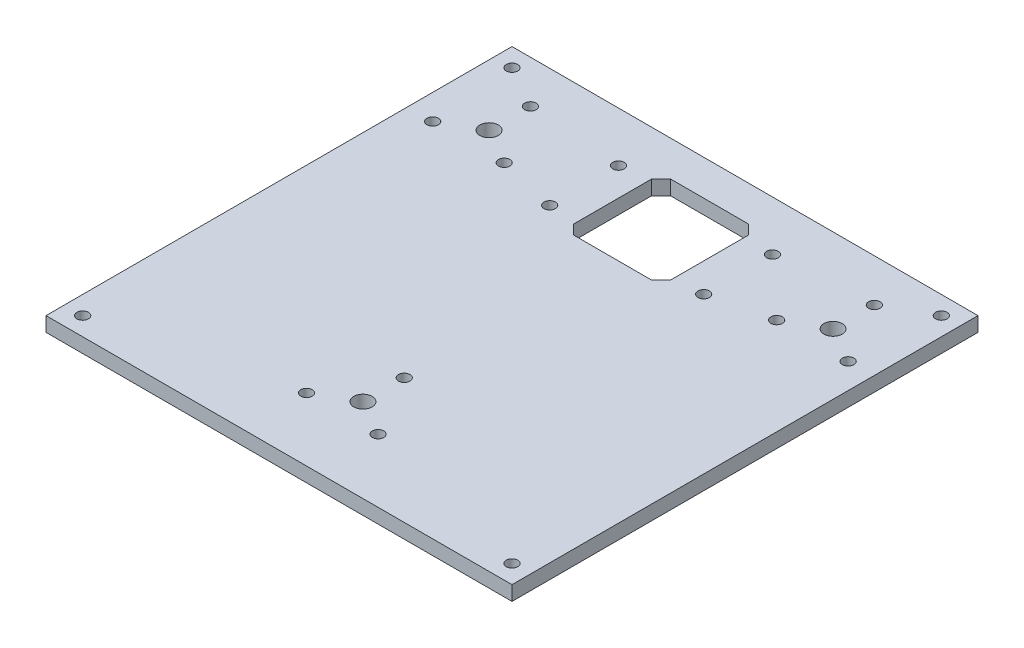
ISO-10303-21;
HEADER;
FILE_DESCRIPTION(('STEP AP214'),'2;1');
FILE_NAME('part.step','',(''),(''),'','','');
FILE_SCHEMA(('AUTOMOTIVE_DESIGN { 1 0 10303 214 1 1 1 1 }'));
ENDSEC;
DATA;
#1=APPLICATION_CONTEXT('core data for automotive mechanical design processes');
#2=APPLICATION_PROTOCOL_DEFINITION('international standard','automotive_design',2000,#1);
#3=PRODUCT_CONTEXT('',#1,'mechanical');
#4=PRODUCT('Part','Part','',(#3));
#5=PRODUCT_RELATED_PRODUCT_CATEGORY('part','',(#4));
#6=PRODUCT_DEFINITION_FORMATION('','',#4);
#7=PRODUCT_DEFINITION_CONTEXT('part definition',#1,'design');
#8=PRODUCT_DEFINITION('design','',#6,#7);
#9=PRODUCT_DEFINITION_SHAPE('','',#8);
#10=(LENGTH_UNIT() NAMED_UNIT(*) SI_UNIT(.MILLI.,.METRE.));
#11=(NAMED_UNIT(*) PLANE_ANGLE_UNIT() SI_UNIT($,.RADIAN.));
#12=(NAMED_UNIT(*) SI_UNIT($,.STERADIAN.) SOLID_ANGLE_UNIT());
#13=UNCERTAINTY_MEASURE_WITH_UNIT(LENGTH_MEASURE(1.E-05),#10,'distance_accuracy_value','');
#14=(GEOMETRIC_REPRESENTATION_CONTEXT(3) GLOBAL_UNCERTAINTY_ASSIGNED_CONTEXT((#13)) GLOBAL_UNIT_ASSIGNED_CONTEXT((#10,
#11,#12)) REPRESENTATION_CONTEXT('',''));
#15=CARTESIAN_POINT('',(0.,0.,0.));
#16=DIRECTION('',(0.,0.,1.));
#17=DIRECTION('',(1.,0.,0.));
#18=AXIS2_PLACEMENT_3D('',#15,#16,#17);
#19=CARTESIAN_POINT('',(101.6,6.35,101.6));
#20=DIRECTION('',(-1.,0.,0.));
#21=DIRECTION('',(0.,0.,1.));
#22=AXIS2_PLACEMENT_3D('',#19,#20,#21);
#23=PLANE('',#22);
#24=DIRECTION('',(0.,0.,-1.));
#25=VECTOR('',#24,1.);
#26=CARTESIAN_POINT('',(101.6,0.,101.6));
#27=LINE('',#26,#25);
#28=CARTESIAN_POINT('',(101.6,0.,101.6));
#29=VERTEX_POINT('',#28);
#30=CARTESIAN_POINT('',(101.6,0.,-101.6));
#31=VERTEX_POINT('',#30);
#32=EDGE_CURVE('E199',#29,#31,#27,.T.);
#33=ORIENTED_EDGE('',*,*,#32,.T.);
#34=DIRECTION('',(0.,-1.,0.));
#35=VECTOR('',#34,1.);
#36=CARTESIAN_POINT('',(101.6,6.35,-101.6));
#37=LINE('',#36,#35);
#38=CARTESIAN_POINT('',(101.6,6.35,-101.6));
#39=VERTEX_POINT('',#38);
#40=EDGE_CURVE('E11',#39,#31,#37,.T.);
#41=ORIENTED_EDGE('',*,*,#40,.F.);
#42=DIRECTION('',(0.,0.,-1.));
#43=VECTOR('',#42,1.);
#44=CARTESIAN_POINT('',(101.6,6.35,101.6));
#45=LINE('',#44,#43);
#46=CARTESIAN_POINT('',(101.6,6.35,101.6));
#47=VERTEX_POINT('',#46);
#48=EDGE_CURVE('E214',#47,#39,#45,.T.);
#49=ORIENTED_EDGE('',*,*,#48,.F.);
#50=DIRECTION('',(0.,-1.,0.));
#51=VECTOR('',#50,1.);
#52=CARTESIAN_POINT('',(101.6,6.35,101.6));
#53=LINE('',#52,#51);
#54=EDGE_CURVE('E224',#47,#29,#53,.T.);
#55=ORIENTED_EDGE('',*,*,#54,.T.);
#56=EDGE_LOOP('',(#33,#41,#49,#55));
#57=FACE_BOUND('',#56,.T.);
#58=ADVANCED_FACE('F35',(#57),#23,.F.);
#59=CARTESIAN_POINT('',(-101.6,6.35,-101.6));
#60=DIRECTION('',(0.,0.,1.));
#61=DIRECTION('',(1.,0.,0.));
#62=AXIS2_PLACEMENT_3D('',#59,#60,#61);
#63=PLANE('',#62);
#64=DIRECTION('',(-1.,0.,0.));
#65=VECTOR('',#64,1.);
#66=CARTESIAN_POINT('',(-101.6,0.,-101.6));
#67=LINE('',#66,#65);
#68=CARTESIAN_POINT('',(-101.6,0.,-101.6));
#69=VERTEX_POINT('',#68);
#70=EDGE_CURVE('E227',#31,#69,#67,.T.);
#71=ORIENTED_EDGE('',*,*,#70,.T.);
#72=DIRECTION('',(0.,-1.,0.));
#73=VECTOR('',#72,1.);
#74=CARTESIAN_POINT('',(-101.6,6.35,-101.6));
#75=LINE('',#74,#73);
#76=CARTESIAN_POINT('',(-101.6,6.35,-101.6));
#77=VERTEX_POINT('',#76);
#78=EDGE_CURVE('E42',#77,#69,#75,.T.);
#79=ORIENTED_EDGE('',*,*,#78,.F.);
#80=DIRECTION('',(-1.,0.,0.));
#81=VECTOR('',#80,1.);
#82=CARTESIAN_POINT('',(-101.6,6.35,-101.6));
#83=LINE('',#82,#81);
#84=EDGE_CURVE('E217',#39,#77,#83,.T.);
#85=ORIENTED_EDGE('',*,*,#84,.F.);
#86=ORIENTED_EDGE('',*,*,#40,.T.);
#87=EDGE_LOOP('',(#71,#79,#85,#86));
#88=FACE_BOUND('',#87,.T.);
#89=ADVANCED_FACE('F256',(#88),#63,.F.);
#90=CARTESIAN_POINT('',(-101.6,6.35,101.6));
#91=DIRECTION('',(1.,0.,0.));
#92=DIRECTION('',(0.,0.,-1.));
#93=AXIS2_PLACEMENT_3D('',#90,#91,#92);
#94=PLANE('',#93);
#95=DIRECTION('',(0.,0.,1.));
#96=VECTOR('',#95,1.);
#97=CARTESIAN_POINT('',(-101.6,0.,101.6));
#98=LINE('',#97,#96);
#99=CARTESIAN_POINT('',(-101.6,0.,101.6));
#100=VERTEX_POINT('',#99);
#101=EDGE_CURVE('E229',#69,#100,#98,.T.);
#102=ORIENTED_EDGE('',*,*,#101,.T.);
#103=DIRECTION('',(0.,-1.,0.));
#104=VECTOR('',#103,1.);
#105=CARTESIAN_POINT('',(-101.6,6.35,101.6));
#106=LINE('',#105,#104);
#107=CARTESIAN_POINT('',(-101.6,6.35,101.6));
#108=VERTEX_POINT('',#107);
#109=EDGE_CURVE('E234',#108,#100,#106,.T.);
#110=ORIENTED_EDGE('',*,*,#109,.F.);
#111=DIRECTION('',(0.,0.,1.));
#112=VECTOR('',#111,1.);
#113=CARTESIAN_POINT('',(-101.6,6.35,101.6));
#114=LINE('',#113,#112);
#115=EDGE_CURVE('E220',#77,#108,#114,.T.);
#116=ORIENTED_EDGE('',*,*,#115,.F.);
#117=ORIENTED_EDGE('',*,*,#78,.T.);
#118=EDGE_LOOP('',(#102,#110,#116,#117));
#119=FACE_BOUND('',#118,.T.);
#120=ADVANCED_FACE('F241',(#119),#94,.F.);
#121=CARTESIAN_POINT('',(-101.6,6.35,101.6));
#122=DIRECTION('',(0.,0.,-1.));
#123=DIRECTION('',(-1.,0.,0.));
#124=AXIS2_PLACEMENT_3D('',#121,#122,#123);
#125=PLANE('',#124);
#126=DIRECTION('',(1.,0.,0.));
#127=VECTOR('',#126,1.);
#128=CARTESIAN_POINT('',(-101.6,0.,101.6));
#129=LINE('',#128,#127);
#130=EDGE_CURVE('E218',#100,#29,#129,.T.);
#131=ORIENTED_EDGE('',*,*,#130,.T.);
#132=ORIENTED_EDGE('',*,*,#54,.F.);
#133=DIRECTION('',(1.,0.,0.));
#134=VECTOR('',#133,1.);
#135=CARTESIAN_POINT('',(-101.6,6.35,101.6));
#136=LINE('',#135,#134);
#137=EDGE_CURVE('E222',#108,#47,#136,.T.);
#138=ORIENTED_EDGE('',*,*,#137,.F.);
#139=ORIENTED_EDGE('',*,*,#109,.T.);
#140=EDGE_LOOP('',(#131,#132,#138,#139));
#141=FACE_BOUND('',#140,.T.);
#142=ADVANCED_FACE('F249',(#141),#125,.F.);
#143=CARTESIAN_POINT('',(0.,6.35,0.));
#144=DIRECTION('',(0.,-1.,0.));
#145=DIRECTION('',(0.,0.,-1.));
#146=AXIS2_PLACEMENT_3D('',#143,#144,#145);
#147=PLANE('',#146);
#148=CARTESIAN_POINT('',(15.5884572681198,6.35,74.0000000000001));
#149=DIRECTION('',(0.,1.,0.));
#150=DIRECTION('',(0.,0.,1.));
#151=AXIS2_PLACEMENT_3D('',#148,#149,#150);
#152=CIRCLE('',#151,2.5);
#153=CARTESIAN_POINT('',(15.5884572681198,6.35,76.5000000000001));
#154=VERTEX_POINT('',#153);
#155=EDGE_CURVE('E414',#154,#154,#152,.T.);
#156=ORIENTED_EDGE('',*,*,#155,.F.);
#157=EDGE_LOOP('',(#156));
#158=FACE_BOUND('',#157,.T.);
#159=CARTESIAN_POINT('',(0.,6.35,47.0000000000001));
#160=DIRECTION('',(0.,1.,0.));
#161=DIRECTION('',(0.,0.,1.));
#162=AXIS2_PLACEMENT_3D('',#159,#160,#161);
#163=CIRCLE('',#162,2.5);
#164=CARTESIAN_POINT('',(0.,6.35,49.5000000000001));
#165=VERTEX_POINT('',#164);
#166=EDGE_CURVE('E420',#165,#165,#163,.T.);
#167=ORIENTED_EDGE('',*,*,#166,.F.);
#168=EDGE_LOOP('',(#167));
#169=FACE_BOUND('',#168,.T.);
#170=CARTESIAN_POINT('',(90.5884572681198,6.35,-55.9999999999998));
#171=DIRECTION('',(0.,1.,0.));
#172=DIRECTION('',(0.,0.,1.));
#173=AXIS2_PLACEMENT_3D('',#170,#171,#172);
#174=CIRCLE('',#173,2.5);
#175=CARTESIAN_POINT('',(90.5884572681198,6.35,-53.4999999999998));
#176=VERTEX_POINT('',#175);
#177=EDGE_CURVE('E426',#176,#176,#174,.T.);
#178=ORIENTED_EDGE('',*,*,#177,.F.);
#179=EDGE_LOOP('',(#178));
#180=FACE_BOUND('',#179,.T.);
#181=CARTESIAN_POINT('',(59.41154273188,6.35,-55.9999999999998));
#182=DIRECTION('',(0.,1.,0.));
#183=DIRECTION('',(0.,0.,1.));
#184=AXIS2_PLACEMENT_3D('',#181,#182,#183);
#185=CIRCLE('',#184,2.50000000000001);
#186=CARTESIAN_POINT('',(59.41154273188,6.35,-53.4999999999998));
#187=VERTEX_POINT('',#186);
#188=EDGE_CURVE('E401',#187,#187,#185,.T.);
#189=ORIENTED_EDGE('',*,*,#188,.F.);
#190=EDGE_LOOP('',(#189));
#191=FACE_BOUND('',#190,.T.);
#192=CARTESIAN_POINT('',(-75.,6.35,-82.9999999999998));
#193=DIRECTION('',(0.,1.,0.));
#194=DIRECTION('',(0.,0.,1.));
#195=AXIS2_PLACEMENT_3D('',#192,#193,#194);
#196=CIRCLE('',#195,2.5);
#197=CARTESIAN_POINT('',(-75.,6.35,-80.4999999999998));
#198=VERTEX_POINT('',#197);
#199=EDGE_CURVE('E393',#198,#198,#196,.T.);
#200=ORIENTED_EDGE('',*,*,#199,.F.);
#201=EDGE_LOOP('',(#200));
#202=FACE_BOUND('',#201,.T.);
#203=CARTESIAN_POINT('',(-59.4115427318801,6.35,-55.9999999999998));
#204=DIRECTION('',(0.,1.,0.));
#205=DIRECTION('',(0.,0.,1.));
#206=AXIS2_PLACEMENT_3D('',#203,#204,#205);
#207=CIRCLE('',#206,2.5);
#208=CARTESIAN_POINT('',(-59.4115427318801,6.35,-53.4999999999998));
#209=VERTEX_POINT('',#208);
#210=EDGE_CURVE('E386',#209,#209,#207,.T.);
#211=ORIENTED_EDGE('',*,*,#210,.F.);
#212=EDGE_LOOP('',(#211));
#213=FACE_BOUND('',#212,.T.);
#214=CARTESIAN_POINT('',(-90.5884572681199,6.35,-55.9999999999998));
#215=DIRECTION('',(0.,1.,0.));
#216=DIRECTION('',(0.,0.,1.));
#217=AXIS2_PLACEMENT_3D('',#214,#215,#216);
#218=CIRCLE('',#217,2.5);
#219=CARTESIAN_POINT('',(-90.5884572681199,6.35,-53.4999999999998));
#220=VERTEX_POINT('',#219);
#221=EDGE_CURVE('E390',#220,#220,#218,.T.);
#222=ORIENTED_EDGE('',*,*,#221,.F.);
#223=EDGE_LOOP('',(#222));
#224=FACE_BOUND('',#223,.T.);
#225=CARTESIAN_POINT('',(74.9999999999999,6.35,-82.9999999999998));
#226=DIRECTION('',(0.,1.,0.));
#227=DIRECTION('',(0.,0.,1.));
#228=AXIS2_PLACEMENT_3D('',#225,#226,#227);
#229=CIRCLE('',#228,2.5);
#230=CARTESIAN_POINT('',(74.9999999999999,6.35,-80.4999999999998));
#231=VERTEX_POINT('',#230);
#232=EDGE_CURVE('E402',#231,#231,#229,.T.);
#233=ORIENTED_EDGE('',*,*,#232,.F.);
#234=EDGE_LOOP('',(#233));
#235=FACE_BOUND('',#234,.T.);
#236=CARTESIAN_POINT('',(-15.58845726812,6.35,74.0000000000001));
#237=DIRECTION('',(0.,1.,0.));
#238=DIRECTION('',(0.,0.,1.));
#239=AXIS2_PLACEMENT_3D('',#236,#237,#238);
#240=CIRCLE('',#239,2.50000000000001);
#241=CARTESIAN_POINT('',(-15.58845726812,6.35,76.5000000000001));
#242=VERTEX_POINT('',#241);
#243=EDGE_CURVE('E413',#242,#242,#240,.T.);
#244=ORIENTED_EDGE('',*,*,#243,.F.);
#245=EDGE_LOOP('',(#244));
#246=FACE_BOUND('',#245,.T.);
#247=CARTESIAN_POINT('',(93.6,6.35,-93.6));
#248=DIRECTION('',(0.,1.,0.));
#249=DIRECTION('',(0.,0.,1.));
#250=AXIS2_PLACEMENT_3D('',#247,#248,#249);
#251=CIRCLE('',#250,2.5);
#252=CARTESIAN_POINT('',(93.6,6.35,-91.1));
#253=VERTEX_POINT('',#252);
#254=EDGE_CURVE('E437',#253,#253,#251,.T.);
#255=ORIENTED_EDGE('',*,*,#254,.F.);
#256=EDGE_LOOP('',(#255));
#257=FACE_BOUND('',#256,.T.);
#258=CARTESIAN_POINT('',(-93.6,6.35,-93.6));
#259=DIRECTION('',(0.,1.,0.));
#260=DIRECTION('',(0.,0.,1.));
#261=AXIS2_PLACEMENT_3D('',#258,#259,#260);
#262=CIRCLE('',#261,2.5);
#263=CARTESIAN_POINT('',(-93.6,6.35,-91.1));
#264=VERTEX_POINT('',#263);
#265=EDGE_CURVE('E450',#264,#264,#262,.T.);
#266=ORIENTED_EDGE('',*,*,#265,.F.);
#267=EDGE_LOOP('',(#266));
#268=FACE_BOUND('',#267,.T.);
#269=CARTESIAN_POINT('',(-93.6,6.35,93.6));
#270=DIRECTION('',(0.,1.,0.));
#271=DIRECTION('',(0.,0.,1.));
#272=AXIS2_PLACEMENT_3D('',#269,#270,#271);
#273=CIRCLE('',#272,2.5);
#274=CARTESIAN_POINT('',(-93.6,6.35,96.1));
#275=VERTEX_POINT('',#274);
#276=EDGE_CURVE('E444',#275,#275,#273,.T.);
#277=ORIENTED_EDGE('',*,*,#276,.F.);
#278=EDGE_LOOP('',(#277));
#279=FACE_BOUND('',#278,.T.);
#280=CARTESIAN_POINT('',(93.6,6.35,93.6));
#281=DIRECTION('',(0.,1.,0.));
#282=DIRECTION('',(0.,0.,1.));
#283=AXIS2_PLACEMENT_3D('',#280,#281,#282);
#284=CIRCLE('',#283,2.5);
#285=CARTESIAN_POINT('',(93.6,6.35,96.1));
#286=VERTEX_POINT('',#285);
#287=EDGE_CURVE('E443',#286,#286,#284,.T.);
#288=ORIENTED_EDGE('',*,*,#287,.F.);
#289=EDGE_LOOP('',(#288));
#290=FACE_BOUND('',#289,.T.);
#291=CARTESIAN_POINT('',(-33.425,6.35,-79.8500000000001));
#292=DIRECTION('',(0.,1.,0.));
#293=DIRECTION('',(0.,0.,1.));
#294=AXIS2_PLACEMENT_3D('',#291,#292,#293);
#295=CIRCLE('',#294,2.5);
#296=CARTESIAN_POINT('',(-33.425,6.35,-77.3500000000001));
#297=VERTEX_POINT('',#296);
#298=EDGE_CURVE('E473',#297,#297,#295,.T.);
#299=ORIENTED_EDGE('',*,*,#298,.F.);
#300=EDGE_LOOP('',(#299));
#301=FACE_BOUND('',#300,.T.);
#302=CARTESIAN_POINT('',(33.725,6.35,-49.8500000000001));
#303=DIRECTION('',(0.,1.,0.));
#304=DIRECTION('',(0.,0.,1.));
#305=AXIS2_PLACEMENT_3D('',#302,#303,#304);
#306=CIRCLE('',#305,2.5);
#307=CARTESIAN_POINT('',(33.725,6.35,-47.3500000000001));
#308=VERTEX_POINT('',#307);
#309=EDGE_CURVE('E467',#308,#308,#306,.T.);
#310=ORIENTED_EDGE('',*,*,#309,.F.);
#311=EDGE_LOOP('',(#310));
#312=FACE_BOUND('',#311,.T.);
#313=CARTESIAN_POINT('',(33.725,6.35,-79.8500000000001));
#314=DIRECTION('',(0.,1.,0.));
#315=DIRECTION('',(0.,0.,1.));
#316=AXIS2_PLACEMENT_3D('',#313,#314,#315);
#317=CIRCLE('',#316,2.5);
#318=CARTESIAN_POINT('',(33.725,6.35,-77.3500000000001));
#319=VERTEX_POINT('',#318);
#320=EDGE_CURVE('E461',#319,#319,#317,.T.);
#321=ORIENTED_EDGE('',*,*,#320,.F.);
#322=EDGE_LOOP('',(#321));
#323=FACE_BOUND('',#322,.T.);
#324=CARTESIAN_POINT('',(-33.425,6.35,-49.8500000000001));
#325=DIRECTION('',(0.,1.,0.));
#326=DIRECTION('',(0.,0.,1.));
#327=AXIS2_PLACEMENT_3D('',#324,#325,#326);
#328=CIRCLE('',#327,2.5);
#329=CARTESIAN_POINT('',(-33.425,6.35,-47.3500000000001));
#330=VERTEX_POINT('',#329);
#331=EDGE_CURVE('E148',#330,#330,#328,.T.);
#332=ORIENTED_EDGE('',*,*,#331,.F.);
#333=EDGE_LOOP('',(#332));
#334=FACE_BOUND('',#333,.T.);
#335=DIRECTION('',(-0.707106781186547,0.,0.707106781186548));
#336=VECTOR('',#335,1.);
#337=CARTESIAN_POINT('',(-17.05,6.35,-86.15));
#338=LINE('',#337,#336);
#339=CARTESIAN_POINT('',(-17.05,6.35,-86.15));
#340=VERTEX_POINT('',#339);
#341=CARTESIAN_POINT('',(-21.15,6.35,-82.05));
#342=VERTEX_POINT('',#341);
#343=EDGE_CURVE('E165',#340,#342,#338,.T.);
#344=ORIENTED_EDGE('',*,*,#343,.F.);
#345=DIRECTION('',(-1.,0.,0.));
#346=VECTOR('',#345,1.);
#347=CARTESIAN_POINT('',(17.05,6.35,-86.15));
#348=LINE('',#347,#346);
#349=CARTESIAN_POINT('',(17.05,6.35,-86.15));
#350=VERTEX_POINT('',#349);
#351=EDGE_CURVE('E49',#350,#340,#348,.T.);
#352=ORIENTED_EDGE('',*,*,#351,.F.);
#353=DIRECTION('',(-0.707106781186548,0.,-0.707106781186547));
#354=VECTOR('',#353,1.);
#355=CARTESIAN_POINT('',(21.15,6.35,-82.05));
#356=LINE('',#355,#354);
#357=CARTESIAN_POINT('',(21.15,6.35,-82.05));
#358=VERTEX_POINT('',#357);
#359=EDGE_CURVE('E142',#358,#350,#356,.T.);
#360=ORIENTED_EDGE('',*,*,#359,.F.);
#361=DIRECTION('',(0.,0.,-1.));
#362=VECTOR('',#361,1.);
#363=CARTESIAN_POINT('',(21.15,6.35,-47.95));
#364=LINE('',#363,#362);
#365=CARTESIAN_POINT('',(21.15,6.35,-47.95));
#366=VERTEX_POINT('',#365);
#367=EDGE_CURVE('E145',#366,#358,#364,.T.);
#368=ORIENTED_EDGE('',*,*,#367,.F.);
#369=DIRECTION('',(0.707106781186548,0.,-0.707106781186548));
#370=VECTOR('',#369,1.);
#371=CARTESIAN_POINT('',(17.05,6.35,-43.85));
#372=LINE('',#371,#370);
#373=CARTESIAN_POINT('',(17.05,6.35,-43.85));
#374=VERTEX_POINT('',#373);
#375=EDGE_CURVE('E177',#374,#366,#372,.T.);
#376=ORIENTED_EDGE('',*,*,#375,.F.);
#377=DIRECTION('',(1.,0.,0.));
#378=VECTOR('',#377,1.);
#379=CARTESIAN_POINT('',(-17.05,6.35,-43.85));
#380=LINE('',#379,#378);
#381=CARTESIAN_POINT('',(-17.05,6.35,-43.85));
#382=VERTEX_POINT('',#381);
#383=EDGE_CURVE('E174',#382,#374,#380,.T.);
#384=ORIENTED_EDGE('',*,*,#383,.F.);
#385=DIRECTION('',(0.707106781186547,0.,0.707106781186548));
#386=VECTOR('',#385,1.);
#387=CARTESIAN_POINT('',(-21.15,6.35,-47.95));
#388=LINE('',#387,#386);
#389=CARTESIAN_POINT('',(-21.15,6.35,-47.95));
#390=VERTEX_POINT('',#389);
#391=EDGE_CURVE('E171',#390,#382,#388,.T.);
#392=ORIENTED_EDGE('',*,*,#391,.F.);
#393=DIRECTION('',(0.,0.,1.));
#394=VECTOR('',#393,1.);
#395=CARTESIAN_POINT('',(-21.15,6.35,-82.05));
#396=LINE('',#395,#394);
#397=EDGE_CURVE('E168',#342,#390,#396,.T.);
#398=ORIENTED_EDGE('',*,*,#397,.F.);
#399=EDGE_LOOP('',(#344,#352,#360,#368,#376,#384,#392,#398));
#400=FACE_BOUND('',#399,.T.);
#401=CARTESIAN_POINT('',(-75.,6.35,-65.));
#402=DIRECTION('',(0.,1.,0.));
#403=DIRECTION('',(0.,0.,1.));
#404=AXIS2_PLACEMENT_3D('',#401,#402,#403);
#405=CIRCLE('',#404,4.00000000000002);
#406=CARTESIAN_POINT('',(-75.,6.35,-61.));
#407=VERTEX_POINT('',#406);
#408=EDGE_CURVE('E200',#407,#407,#405,.T.);
#409=ORIENTED_EDGE('',*,*,#408,.F.);
#410=EDGE_LOOP('',(#409));
#411=FACE_BOUND('',#410,.T.);
#412=CARTESIAN_POINT('',(75.,6.35,-65.));
#413=DIRECTION('',(0.,1.,0.));
#414=DIRECTION('',(0.,0.,1.));
#415=AXIS2_PLACEMENT_3D('',#412,#413,#414);
#416=CIRCLE('',#415,4.00000000000002);
#417=CARTESIAN_POINT('',(75.,6.35,-61.));
#418=VERTEX_POINT('',#417);
#419=EDGE_CURVE('E206',#418,#418,#416,.T.);
#420=ORIENTED_EDGE('',*,*,#419,.F.);
#421=EDGE_LOOP('',(#420));
#422=FACE_BOUND('',#421,.T.);
#423=CARTESIAN_POINT('',(0.,6.35,65.));
#424=DIRECTION('',(0.,1.,0.));
#425=DIRECTION('',(0.,0.,1.));
#426=AXIS2_PLACEMENT_3D('',#423,#424,#425);
#427=CIRCLE('',#426,4.);
#428=CARTESIAN_POINT('',(0.,6.35,69.));
#429=VERTEX_POINT('',#428);
#430=EDGE_CURVE('E184',#429,#429,#427,.T.);
#431=ORIENTED_EDGE('',*,*,#430,.F.);
#432=EDGE_LOOP('',(#431));
#433=FACE_BOUND('',#432,.T.);
#434=ORIENTED_EDGE('',*,*,#48,.T.);
#435=ORIENTED_EDGE('',*,*,#84,.T.);
#436=ORIENTED_EDGE('',*,*,#115,.T.);
#437=ORIENTED_EDGE('',*,*,#137,.T.);
#438=EDGE_LOOP('',(#434,#435,#436,#437));
#439=FACE_BOUND('',#438,.T.);
#440=ADVANCED_FACE('F255',(#158,#169,#180,#191,#202,#213,#224,#235,#246,#257,#268,#279,#290,
#301,#312,#323,#334,#400,#411,#422,#433,#439),#147,.F.);
#441=CARTESIAN_POINT('',(0.,0.,0.));
#442=DIRECTION('',(0.,-1.,0.));
#443=DIRECTION('',(0.,0.,-1.));
#444=AXIS2_PLACEMENT_3D('',#441,#442,#443);
#445=PLANE('',#444);
#446=CARTESIAN_POINT('',(15.5884572681198,0.,74.0000000000001));
#447=DIRECTION('',(0.,1.,0.));
#448=DIRECTION('',(0.,0.,1.));
#449=AXIS2_PLACEMENT_3D('',#446,#447,#448);
#450=CIRCLE('',#449,2.5);
#451=CARTESIAN_POINT('',(15.5884572681198,0.,76.5000000000001));
#452=VERTEX_POINT('',#451);
#453=EDGE_CURVE('E410',#452,#452,#450,.T.);
#454=ORIENTED_EDGE('',*,*,#453,.T.);
#455=EDGE_LOOP('',(#454));
#456=FACE_BOUND('',#455,.T.);
#457=CARTESIAN_POINT('',(0.,0.,47.0000000000001));
#458=DIRECTION('',(0.,1.,0.));
#459=DIRECTION('',(0.,0.,1.));
#460=AXIS2_PLACEMENT_3D('',#457,#458,#459);
#461=CIRCLE('',#460,2.5);
#462=CARTESIAN_POINT('',(0.,0.,49.5000000000001));
#463=VERTEX_POINT('',#462);
#464=EDGE_CURVE('E417',#463,#463,#461,.T.);
#465=ORIENTED_EDGE('',*,*,#464,.T.);
#466=EDGE_LOOP('',(#465));
#467=FACE_BOUND('',#466,.T.);
#468=CARTESIAN_POINT('',(90.5884572681198,0.,-55.9999999999998));
#469=DIRECTION('',(0.,1.,0.));
#470=DIRECTION('',(0.,0.,1.));
#471=AXIS2_PLACEMENT_3D('',#468,#469,#470);
#472=CIRCLE('',#471,2.5);
#473=CARTESIAN_POINT('',(90.5884572681198,0.,-53.4999999999998));
#474=VERTEX_POINT('',#473);
#475=EDGE_CURVE('E423',#474,#474,#472,.T.);
#476=ORIENTED_EDGE('',*,*,#475,.T.);
#477=EDGE_LOOP('',(#476));
#478=FACE_BOUND('',#477,.T.);
#479=CARTESIAN_POINT('',(59.41154273188,0.,-55.9999999999998));
#480=DIRECTION('',(0.,1.,0.));
#481=DIRECTION('',(0.,0.,1.));
#482=AXIS2_PLACEMENT_3D('',#479,#480,#481);
#483=CIRCLE('',#482,2.50000000000001);
#484=CARTESIAN_POINT('',(59.41154273188,0.,-53.4999999999998));
#485=VERTEX_POINT('',#484);
#486=EDGE_CURVE('E429',#485,#485,#483,.T.);
#487=ORIENTED_EDGE('',*,*,#486,.T.);
#488=EDGE_LOOP('',(#487));
#489=FACE_BOUND('',#488,.T.);
#490=CARTESIAN_POINT('',(-75.,0.,-82.9999999999998));
#491=DIRECTION('',(0.,1.,0.));
#492=DIRECTION('',(0.,0.,1.));
#493=AXIS2_PLACEMENT_3D('',#490,#491,#492);
#494=CIRCLE('',#493,2.5);
#495=CARTESIAN_POINT('',(-75.,0.,-80.4999999999998));
#496=VERTEX_POINT('',#495);
#497=EDGE_CURVE('E388',#496,#496,#494,.T.);
#498=ORIENTED_EDGE('',*,*,#497,.T.);
#499=EDGE_LOOP('',(#498));
#500=FACE_BOUND('',#499,.T.);
#501=CARTESIAN_POINT('',(-59.4115427318801,0.,-55.9999999999998));
#502=DIRECTION('',(0.,1.,0.));
#503=DIRECTION('',(0.,0.,1.));
#504=AXIS2_PLACEMENT_3D('',#501,#502,#503);
#505=CIRCLE('',#504,2.5);
#506=CARTESIAN_POINT('',(-59.4115427318801,0.,-53.4999999999998));
#507=VERTEX_POINT('',#506);
#508=EDGE_CURVE('E383',#507,#507,#505,.T.);
#509=ORIENTED_EDGE('',*,*,#508,.T.);
#510=EDGE_LOOP('',(#509));
#511=FACE_BOUND('',#510,.T.);
#512=CARTESIAN_POINT('',(-90.5884572681199,0.,-55.9999999999998));
#513=DIRECTION('',(0.,1.,0.));
#514=DIRECTION('',(0.,0.,1.));
#515=AXIS2_PLACEMENT_3D('',#512,#513,#514);
#516=CIRCLE('',#515,2.5);
#517=CARTESIAN_POINT('',(-90.5884572681199,0.,-53.4999999999998));
#518=VERTEX_POINT('',#517);
#519=EDGE_CURVE('E405',#518,#518,#516,.T.);
#520=ORIENTED_EDGE('',*,*,#519,.T.);
#521=EDGE_LOOP('',(#520));
#522=FACE_BOUND('',#521,.T.);
#523=CARTESIAN_POINT('',(74.9999999999999,0.,-82.9999999999998));
#524=DIRECTION('',(0.,1.,0.));
#525=DIRECTION('',(0.,0.,1.));
#526=AXIS2_PLACEMENT_3D('',#523,#524,#525);
#527=CIRCLE('',#526,2.5);
#528=CARTESIAN_POINT('',(74.9999999999999,0.,-80.4999999999998));
#529=VERTEX_POINT('',#528);
#530=EDGE_CURVE('E398',#529,#529,#527,.T.);
#531=ORIENTED_EDGE('',*,*,#530,.T.);
#532=EDGE_LOOP('',(#531));
#533=FACE_BOUND('',#532,.T.);
#534=CARTESIAN_POINT('',(-15.58845726812,0.,74.0000000000001));
#535=DIRECTION('',(0.,1.,0.));
#536=DIRECTION('',(0.,0.,1.));
#537=AXIS2_PLACEMENT_3D('',#534,#535,#536);
#538=CIRCLE('',#537,2.50000000000001);
#539=CARTESIAN_POINT('',(-15.58845726812,0.,76.5000000000001));
#540=VERTEX_POINT('',#539);
#541=EDGE_CURVE('E434',#540,#540,#538,.T.);
#542=ORIENTED_EDGE('',*,*,#541,.T.);
#543=EDGE_LOOP('',(#542));
#544=FACE_BOUND('',#543,.T.);
#545=CARTESIAN_POINT('',(93.6,0.,-93.6));
#546=DIRECTION('',(0.,1.,0.));
#547=DIRECTION('',(0.,0.,1.));
#548=AXIS2_PLACEMENT_3D('',#545,#546,#547);
#549=CIRCLE('',#548,2.5);
#550=CARTESIAN_POINT('',(93.6,0.,-91.1));
#551=VERTEX_POINT('',#550);
#552=EDGE_CURVE('E453',#551,#551,#549,.T.);
#553=ORIENTED_EDGE('',*,*,#552,.T.);
#554=EDGE_LOOP('',(#553));
#555=FACE_BOUND('',#554,.T.);
#556=CARTESIAN_POINT('',(-93.6,0.,-93.6));
#557=DIRECTION('',(0.,1.,0.));
#558=DIRECTION('',(0.,0.,1.));
#559=AXIS2_PLACEMENT_3D('',#556,#557,#558);
#560=CIRCLE('',#559,2.5);
#561=CARTESIAN_POINT('',(-93.6,0.,-91.1));
#562=VERTEX_POINT('',#561);
#563=EDGE_CURVE('E447',#562,#562,#560,.T.);
#564=ORIENTED_EDGE('',*,*,#563,.T.);
#565=EDGE_LOOP('',(#564));
#566=FACE_BOUND('',#565,.T.);
#567=CARTESIAN_POINT('',(-93.6,0.,93.6));
#568=DIRECTION('',(0.,1.,0.));
#569=DIRECTION('',(0.,0.,1.));
#570=AXIS2_PLACEMENT_3D('',#567,#568,#569);
#571=CIRCLE('',#570,2.5);
#572=CARTESIAN_POINT('',(-93.6,0.,96.1));
#573=VERTEX_POINT('',#572);
#574=EDGE_CURVE('E440',#573,#573,#571,.T.);
#575=ORIENTED_EDGE('',*,*,#574,.T.);
#576=EDGE_LOOP('',(#575));
#577=FACE_BOUND('',#576,.T.);
#578=CARTESIAN_POINT('',(93.6,0.,93.6));
#579=DIRECTION('',(0.,1.,0.));
#580=DIRECTION('',(0.,0.,1.));
#581=AXIS2_PLACEMENT_3D('',#578,#579,#580);
#582=CIRCLE('',#581,2.5);
#583=CARTESIAN_POINT('',(93.6,0.,96.1));
#584=VERTEX_POINT('',#583);
#585=EDGE_CURVE('E458',#584,#584,#582,.T.);
#586=ORIENTED_EDGE('',*,*,#585,.T.);
#587=EDGE_LOOP('',(#586));
#588=FACE_BOUND('',#587,.T.);
#589=CARTESIAN_POINT('',(-33.425,0.,-79.8500000000001));
#590=DIRECTION('',(0.,1.,0.));
#591=DIRECTION('',(0.,0.,1.));
#592=AXIS2_PLACEMENT_3D('',#589,#590,#591);
#593=CIRCLE('',#592,2.5);
#594=CARTESIAN_POINT('',(-33.425,0.,-77.3500000000001));
#595=VERTEX_POINT('',#594);
#596=EDGE_CURVE('E470',#595,#595,#593,.T.);
#597=ORIENTED_EDGE('',*,*,#596,.T.);
#598=EDGE_LOOP('',(#597));
#599=FACE_BOUND('',#598,.T.);
#600=CARTESIAN_POINT('',(33.725,0.,-49.8500000000001));
#601=DIRECTION('',(0.,1.,0.));
#602=DIRECTION('',(0.,0.,1.));
#603=AXIS2_PLACEMENT_3D('',#600,#601,#602);
#604=CIRCLE('',#603,2.5);
#605=CARTESIAN_POINT('',(33.725,0.,-47.3500000000001));
#606=VERTEX_POINT('',#605);
#607=EDGE_CURVE('E476',#606,#606,#604,.T.);
#608=ORIENTED_EDGE('',*,*,#607,.T.);
#609=EDGE_LOOP('',(#608));
#610=FACE_BOUND('',#609,.T.);
#611=CARTESIAN_POINT('',(33.725,0.,-79.8500000000001));
#612=DIRECTION('',(0.,1.,0.));
#613=DIRECTION('',(0.,0.,1.));
#614=AXIS2_PLACEMENT_3D('',#611,#612,#613);
#615=CIRCLE('',#614,2.5);
#616=CARTESIAN_POINT('',(33.725,0.,-77.3500000000001));
#617=VERTEX_POINT('',#616);
#618=EDGE_CURVE('E464',#617,#617,#615,.T.);
#619=ORIENTED_EDGE('',*,*,#618,.T.);
#620=EDGE_LOOP('',(#619));
#621=FACE_BOUND('',#620,.T.);
#622=CARTESIAN_POINT('',(-33.425,0.,-49.8500000000001));
#623=DIRECTION('',(0.,1.,0.));
#624=DIRECTION('',(0.,0.,1.));
#625=AXIS2_PLACEMENT_3D('',#622,#623,#624);
#626=CIRCLE('',#625,2.5);
#627=CARTESIAN_POINT('',(-33.425,0.,-47.3500000000001));
#628=VERTEX_POINT('',#627);
#629=EDGE_CURVE('E166',#628,#628,#626,.T.);
#630=ORIENTED_EDGE('',*,*,#629,.T.);
#631=EDGE_LOOP('',(#630));
#632=FACE_BOUND('',#631,.T.);
#633=DIRECTION('',(-1.,0.,0.));
#634=VECTOR('',#633,1.);
#635=CARTESIAN_POINT('',(17.05,0.,-86.15));
#636=LINE('',#635,#634);
#637=CARTESIAN_POINT('',(17.05,0.,-86.15));
#638=VERTEX_POINT('',#637);
#639=CARTESIAN_POINT('',(-17.05,0.,-86.15));
#640=VERTEX_POINT('',#639);
#641=EDGE_CURVE('E125',#638,#640,#636,.T.);
#642=ORIENTED_EDGE('',*,*,#641,.T.);
#643=DIRECTION('',(-0.707106781186547,0.,0.707106781186548));
#644=VECTOR('',#643,1.);
#645=CARTESIAN_POINT('',(-17.05,0.,-86.15));
#646=LINE('',#645,#644);
#647=CARTESIAN_POINT('',(-21.15,0.,-82.05));
#648=VERTEX_POINT('',#647);
#649=EDGE_CURVE('E134',#640,#648,#646,.T.);
#650=ORIENTED_EDGE('',*,*,#649,.T.);
#651=DIRECTION('',(0.,0.,1.));
#652=VECTOR('',#651,1.);
#653=CARTESIAN_POINT('',(-21.15,0.,-82.05));
#654=LINE('',#653,#652);
#655=CARTESIAN_POINT('',(-21.15,0.,-47.95));
#656=VERTEX_POINT('',#655);
#657=EDGE_CURVE('E57',#648,#656,#654,.T.);
#658=ORIENTED_EDGE('',*,*,#657,.T.);
#659=DIRECTION('',(0.707106781186547,0.,0.707106781186548));
#660=VECTOR('',#659,1.);
#661=CARTESIAN_POINT('',(-21.15,0.,-47.95));
#662=LINE('',#661,#660);
#663=CARTESIAN_POINT('',(-17.05,0.,-43.85));
#664=VERTEX_POINT('',#663);
#665=EDGE_CURVE('E152',#656,#664,#662,.T.);
#666=ORIENTED_EDGE('',*,*,#665,.T.);
#667=DIRECTION('',(1.,0.,0.));
#668=VECTOR('',#667,1.);
#669=CARTESIAN_POINT('',(-17.05,0.,-43.85));
#670=LINE('',#669,#668);
#671=CARTESIAN_POINT('',(17.05,0.,-43.85));
#672=VERTEX_POINT('',#671);
#673=EDGE_CURVE('E155',#664,#672,#670,.T.);
#674=ORIENTED_EDGE('',*,*,#673,.T.);
#675=DIRECTION('',(0.707106781186548,0.,-0.707106781186548));
#676=VECTOR('',#675,1.);
#677=CARTESIAN_POINT('',(17.05,0.,-43.85));
#678=LINE('',#677,#676);
#679=CARTESIAN_POINT('',(21.15,0.,-47.95));
#680=VERTEX_POINT('',#679);
#681=EDGE_CURVE('E158',#672,#680,#678,.T.);
#682=ORIENTED_EDGE('',*,*,#681,.T.);
#683=DIRECTION('',(0.,0.,-1.));
#684=VECTOR('',#683,1.);
#685=CARTESIAN_POINT('',(21.15,0.,-47.95));
#686=LINE('',#685,#684);
#687=CARTESIAN_POINT('',(21.15,0.,-82.05));
#688=VERTEX_POINT('',#687);
#689=EDGE_CURVE('E161',#680,#688,#686,.T.);
#690=ORIENTED_EDGE('',*,*,#689,.T.);
#691=DIRECTION('',(-0.707106781186548,0.,-0.707106781186547));
#692=VECTOR('',#691,1.);
#693=CARTESIAN_POINT('',(21.15,0.,-82.05));
#694=LINE('',#693,#692);
#695=EDGE_CURVE('E131',#688,#638,#694,.T.);
#696=ORIENTED_EDGE('',*,*,#695,.T.);
#697=EDGE_LOOP('',(#642,#650,#658,#666,#674,#682,#690,#696));
#698=FACE_BOUND('',#697,.T.);
#699=CARTESIAN_POINT('',(-75.,0.,-65.));
#700=DIRECTION('',(0.,1.,0.));
#701=DIRECTION('',(0.,0.,1.));
#702=AXIS2_PLACEMENT_3D('',#699,#700,#701);
#703=CIRCLE('',#702,4.00000000000002);
#704=CARTESIAN_POINT('',(-75.,0.,-61.));
#705=VERTEX_POINT('',#704);
#706=EDGE_CURVE('E196',#705,#705,#703,.T.);
#707=ORIENTED_EDGE('',*,*,#706,.T.);
#708=EDGE_LOOP('',(#707));
#709=FACE_BOUND('',#708,.T.);
#710=CARTESIAN_POINT('',(75.,0.,-65.));
#711=DIRECTION('',(0.,1.,0.));
#712=DIRECTION('',(0.,0.,1.));
#713=AXIS2_PLACEMENT_3D('',#710,#711,#712);
#714=CIRCLE('',#713,4.00000000000002);
#715=CARTESIAN_POINT('',(75.,0.,-61.));
#716=VERTEX_POINT('',#715);
#717=EDGE_CURVE('E203',#716,#716,#714,.T.);
#718=ORIENTED_EDGE('',*,*,#717,.T.);
#719=EDGE_LOOP('',(#718));
#720=FACE_BOUND('',#719,.T.);
#721=CARTESIAN_POINT('',(0.,0.,65.));
#722=DIRECTION('',(0.,1.,0.));
#723=DIRECTION('',(0.,0.,1.));
#724=AXIS2_PLACEMENT_3D('',#721,#722,#723);
#725=CIRCLE('',#724,4.);
#726=CARTESIAN_POINT('',(0.,0.,69.));
#727=VERTEX_POINT('',#726);
#728=EDGE_CURVE('E209',#727,#727,#725,.T.);
#729=ORIENTED_EDGE('',*,*,#728,.T.);
#730=EDGE_LOOP('',(#729));
#731=FACE_BOUND('',#730,.T.);
#732=ORIENTED_EDGE('',*,*,#32,.F.);
#733=ORIENTED_EDGE('',*,*,#130,.F.);
#734=ORIENTED_EDGE('',*,*,#101,.F.);
#735=ORIENTED_EDGE('',*,*,#70,.F.);
#736=EDGE_LOOP('',(#732,#733,#734,#735));
#737=FACE_BOUND('',#736,.T.);
#738=ADVANCED_FACE('F138',(#456,#467,#478,#489,#500,#511,#522,#533,#544,#555,#566,#577,#588,
#599,#610,#621,#632,#698,#709,#720,#731,#737),#445,.T.);
#739=CARTESIAN_POINT('',(0.,0.,65.));
#740=DIRECTION('',(0.,1.,0.));
#741=DIRECTION('',(0.,0.,1.));
#742=AXIS2_PLACEMENT_3D('',#739,#740,#741);
#743=CYLINDRICAL_SURFACE('',#742,4.);
#744=ORIENTED_EDGE('',*,*,#728,.F.);
#745=EDGE_LOOP('',(#744));
#746=FACE_BOUND('',#745,.T.);
#747=ORIENTED_EDGE('',*,*,#430,.T.);
#748=EDGE_LOOP('',(#747));
#749=FACE_BOUND('',#748,.T.);
#750=ADVANCED_FACE('F268',(#746,#749),#743,.F.);
#751=CARTESIAN_POINT('',(75.,0.,-65.));
#752=DIRECTION('',(0.,1.,0.));
#753=DIRECTION('',(0.,0.,1.));
#754=AXIS2_PLACEMENT_3D('',#751,#752,#753);
#755=CYLINDRICAL_SURFACE('',#754,4.00000000000002);
#756=ORIENTED_EDGE('',*,*,#717,.F.);
#757=EDGE_LOOP('',(#756));
#758=FACE_BOUND('',#757,.T.);
#759=ORIENTED_EDGE('',*,*,#419,.T.);
#760=EDGE_LOOP('',(#759));
#761=FACE_BOUND('',#760,.T.);
#762=ADVANCED_FACE('F275',(#758,#761),#755,.F.);
#763=CARTESIAN_POINT('',(-75.,0.,-65.));
#764=DIRECTION('',(0.,1.,0.));
#765=DIRECTION('',(0.,0.,1.));
#766=AXIS2_PLACEMENT_3D('',#763,#764,#765);
#767=CYLINDRICAL_SURFACE('',#766,4.00000000000002);
#768=ORIENTED_EDGE('',*,*,#706,.F.);
#769=EDGE_LOOP('',(#768));
#770=FACE_BOUND('',#769,.T.);
#771=ORIENTED_EDGE('',*,*,#408,.T.);
#772=EDGE_LOOP('',(#771));
#773=FACE_BOUND('',#772,.T.);
#774=ADVANCED_FACE('F279',(#770,#773),#767,.F.);
#775=CARTESIAN_POINT('',(17.05,0.,-86.15));
#776=DIRECTION('',(0.,0.,-1.));
#777=DIRECTION('',(-1.,0.,0.));
#778=AXIS2_PLACEMENT_3D('',#775,#776,#777);
#779=PLANE('',#778);
#780=ORIENTED_EDGE('',*,*,#351,.T.);
#781=DIRECTION('',(0.,1.,0.));
#782=VECTOR('',#781,1.);
#783=CARTESIAN_POINT('',(-17.05,0.,-86.15));
#784=LINE('',#783,#782);
#785=EDGE_CURVE('E121',#640,#340,#784,.T.);
#786=ORIENTED_EDGE('',*,*,#785,.F.);
#787=ORIENTED_EDGE('',*,*,#641,.F.);
#788=DIRECTION('',(0.,1.,0.));
#789=VECTOR('',#788,1.);
#790=CARTESIAN_POINT('',(17.05,0.,-86.15));
#791=LINE('',#790,#789);
#792=EDGE_CURVE('E182',#638,#350,#791,.T.);
#793=ORIENTED_EDGE('',*,*,#792,.T.);
#794=EDGE_LOOP('',(#780,#786,#787,#793));
#795=FACE_BOUND('',#794,.T.);
#796=ADVANCED_FACE('F123',(#795),#779,.F.);
#797=CARTESIAN_POINT('',(21.15,0.,-82.05));
#798=DIRECTION('',(0.707106781186547,0.,-0.707106781186548));
#799=DIRECTION('',(-0.707106781186548,0.,-0.707106781186547));
#800=AXIS2_PLACEMENT_3D('',#797,#798,#799);
#801=PLANE('',#800);
#802=ORIENTED_EDGE('',*,*,#359,.T.);
#803=ORIENTED_EDGE('',*,*,#792,.F.);
#804=ORIENTED_EDGE('',*,*,#695,.F.);
#805=DIRECTION('',(0.,1.,0.));
#806=VECTOR('',#805,1.);
#807=CARTESIAN_POINT('',(21.15,0.,-82.05));
#808=LINE('',#807,#806);
#809=EDGE_CURVE('E185',#688,#358,#808,.T.);
#810=ORIENTED_EDGE('',*,*,#809,.T.);
#811=EDGE_LOOP('',(#802,#803,#804,#810));
#812=FACE_BOUND('',#811,.T.);
#813=ADVANCED_FACE('F286',(#812),#801,.F.);
#814=CARTESIAN_POINT('',(21.15,0.,-47.95));
#815=DIRECTION('',(1.,0.,0.));
#816=DIRECTION('',(0.,0.,-1.));
#817=AXIS2_PLACEMENT_3D('',#814,#815,#816);
#818=PLANE('',#817);
#819=ORIENTED_EDGE('',*,*,#367,.T.);
#820=ORIENTED_EDGE('',*,*,#809,.F.);
#821=ORIENTED_EDGE('',*,*,#689,.F.);
#822=DIRECTION('',(0.,1.,0.));
#823=VECTOR('',#822,1.);
#824=CARTESIAN_POINT('',(21.15,0.,-47.95));
#825=LINE('',#824,#823);
#826=EDGE_CURVE('E187',#680,#366,#825,.T.);
#827=ORIENTED_EDGE('',*,*,#826,.T.);
#828=EDGE_LOOP('',(#819,#820,#821,#827));
#829=FACE_BOUND('',#828,.T.);
#830=ADVANCED_FACE('F304',(#829),#818,.F.);
#831=CARTESIAN_POINT('',(17.05,0.,-43.85));
#832=DIRECTION('',(0.707106781186548,0.,0.707106781186548));
#833=DIRECTION('',(0.707106781186548,0.,-0.707106781186548));
#834=AXIS2_PLACEMENT_3D('',#831,#832,#833);
#835=PLANE('',#834);
#836=ORIENTED_EDGE('',*,*,#375,.T.);
#837=ORIENTED_EDGE('',*,*,#826,.F.);
#838=ORIENTED_EDGE('',*,*,#681,.F.);
#839=DIRECTION('',(0.,1.,0.));
#840=VECTOR('',#839,1.);
#841=CARTESIAN_POINT('',(17.05,0.,-43.85));
#842=LINE('',#841,#840);
#843=EDGE_CURVE('E189',#672,#374,#842,.T.);
#844=ORIENTED_EDGE('',*,*,#843,.T.);
#845=EDGE_LOOP('',(#836,#837,#838,#844));
#846=FACE_BOUND('',#845,.T.);
#847=ADVANCED_FACE('F300',(#846),#835,.F.);
#848=CARTESIAN_POINT('',(-17.05,0.,-43.85));
#849=DIRECTION('',(0.,0.,1.));
#850=DIRECTION('',(1.,0.,0.));
#851=AXIS2_PLACEMENT_3D('',#848,#849,#850);
#852=PLANE('',#851);
#853=ORIENTED_EDGE('',*,*,#383,.T.);
#854=ORIENTED_EDGE('',*,*,#843,.F.);
#855=ORIENTED_EDGE('',*,*,#673,.F.);
#856=DIRECTION('',(0.,1.,0.));
#857=VECTOR('',#856,1.);
#858=CARTESIAN_POINT('',(-17.05,0.,-43.85));
#859=LINE('',#858,#857);
#860=EDGE_CURVE('E191',#664,#382,#859,.T.);
#861=ORIENTED_EDGE('',*,*,#860,.T.);
#862=EDGE_LOOP('',(#853,#854,#855,#861));
#863=FACE_BOUND('',#862,.T.);
#864=ADVANCED_FACE('F296',(#863),#852,.F.);
#865=CARTESIAN_POINT('',(-21.15,0.,-47.95));
#866=DIRECTION('',(-0.707106781186548,0.,0.707106781186547));
#867=DIRECTION('',(0.707106781186547,0.,0.707106781186548));
#868=AXIS2_PLACEMENT_3D('',#865,#866,#867);
#869=PLANE('',#868);
#870=ORIENTED_EDGE('',*,*,#391,.T.);
#871=ORIENTED_EDGE('',*,*,#860,.F.);
#872=ORIENTED_EDGE('',*,*,#665,.F.);
#873=DIRECTION('',(0.,1.,0.));
#874=VECTOR('',#873,1.);
#875=CARTESIAN_POINT('',(-21.15,0.,-47.95));
#876=LINE('',#875,#874);
#877=EDGE_CURVE('E193',#656,#390,#876,.T.);
#878=ORIENTED_EDGE('',*,*,#877,.T.);
#879=EDGE_LOOP('',(#870,#871,#872,#878));
#880=FACE_BOUND('',#879,.T.);
#881=ADVANCED_FACE('F293',(#880),#869,.F.);
#882=CARTESIAN_POINT('',(-21.15,0.,-82.05));
#883=DIRECTION('',(-1.,0.,0.));
#884=DIRECTION('',(0.,0.,1.));
#885=AXIS2_PLACEMENT_3D('',#882,#883,#884);
#886=PLANE('',#885);
#887=ORIENTED_EDGE('',*,*,#397,.T.);
#888=ORIENTED_EDGE('',*,*,#877,.F.);
#889=ORIENTED_EDGE('',*,*,#657,.F.);
#890=DIRECTION('',(0.,1.,0.));
#891=VECTOR('',#890,1.);
#892=CARTESIAN_POINT('',(-21.15,0.,-82.05));
#893=LINE('',#892,#891);
#894=EDGE_CURVE('E130',#648,#342,#893,.T.);
#895=ORIENTED_EDGE('',*,*,#894,.T.);
#896=EDGE_LOOP('',(#887,#888,#889,#895));
#897=FACE_BOUND('',#896,.T.);
#898=ADVANCED_FACE('F290',(#897),#886,.F.);
#899=CARTESIAN_POINT('',(-17.05,0.,-86.15));
#900=DIRECTION('',(-0.707106781186548,0.,-0.707106781186547));
#901=DIRECTION('',(-0.707106781186547,0.,0.707106781186548));
#902=AXIS2_PLACEMENT_3D('',#899,#900,#901);
#903=PLANE('',#902);
#904=ORIENTED_EDGE('',*,*,#343,.T.);
#905=ORIENTED_EDGE('',*,*,#894,.F.);
#906=ORIENTED_EDGE('',*,*,#649,.F.);
#907=ORIENTED_EDGE('',*,*,#785,.T.);
#908=EDGE_LOOP('',(#904,#905,#906,#907));
#909=FACE_BOUND('',#908,.T.);
#910=ADVANCED_FACE('F135',(#909),#903,.F.);
#911=CARTESIAN_POINT('',(-33.425,0.,-49.8500000000001));
#912=DIRECTION('',(0.,1.,0.));
#913=DIRECTION('',(0.,0.,1.));
#914=AXIS2_PLACEMENT_3D('',#911,#912,#913);
#915=CYLINDRICAL_SURFACE('',#914,2.5);
#916=ORIENTED_EDGE('',*,*,#629,.F.);
#917=EDGE_LOOP('',(#916));
#918=FACE_BOUND('',#917,.T.);
#919=ORIENTED_EDGE('',*,*,#331,.T.);
#920=EDGE_LOOP('',(#919));
#921=FACE_BOUND('',#920,.T.);
#922=ADVANCED_FACE('F289',(#918,#921),#915,.F.);
#923=CARTESIAN_POINT('',(33.725,0.,-79.8500000000001));
#924=DIRECTION('',(0.,1.,0.));
#925=DIRECTION('',(0.,0.,1.));
#926=AXIS2_PLACEMENT_3D('',#923,#924,#925);
#927=CYLINDRICAL_SURFACE('',#926,2.5);
#928=ORIENTED_EDGE('',*,*,#618,.F.);
#929=EDGE_LOOP('',(#928));
#930=FACE_BOUND('',#929,.T.);
#931=ORIENTED_EDGE('',*,*,#320,.T.);
#932=EDGE_LOOP('',(#931));
#933=FACE_BOUND('',#932,.T.);
#934=ADVANCED_FACE('F314',(#930,#933),#927,.F.);
#935=CARTESIAN_POINT('',(33.725,0.,-49.8500000000001));
#936=DIRECTION('',(0.,1.,0.));
#937=DIRECTION('',(0.,0.,1.));
#938=AXIS2_PLACEMENT_3D('',#935,#936,#937);
#939=CYLINDRICAL_SURFACE('',#938,2.5);
#940=ORIENTED_EDGE('',*,*,#607,.F.);
#941=EDGE_LOOP('',(#940));
#942=FACE_BOUND('',#941,.T.);
#943=ORIENTED_EDGE('',*,*,#309,.T.);
#944=EDGE_LOOP('',(#943));
#945=FACE_BOUND('',#944,.T.);
#946=ADVANCED_FACE('F316',(#942,#945),#939,.F.);
#947=CARTESIAN_POINT('',(-33.425,0.,-79.8500000000001));
#948=DIRECTION('',(0.,1.,0.));
#949=DIRECTION('',(0.,0.,1.));
#950=AXIS2_PLACEMENT_3D('',#947,#948,#949);
#951=CYLINDRICAL_SURFACE('',#950,2.5);
#952=ORIENTED_EDGE('',*,*,#596,.F.);
#953=EDGE_LOOP('',(#952));
#954=FACE_BOUND('',#953,.T.);
#955=ORIENTED_EDGE('',*,*,#298,.T.);
#956=EDGE_LOOP('',(#955));
#957=FACE_BOUND('',#956,.T.);
#958=ADVANCED_FACE('F319',(#954,#957),#951,.F.);
#959=CARTESIAN_POINT('',(93.6,0.,93.6));
#960=DIRECTION('',(0.,1.,0.));
#961=DIRECTION('',(0.,0.,1.));
#962=AXIS2_PLACEMENT_3D('',#959,#960,#961);
#963=CYLINDRICAL_SURFACE('',#962,2.5);
#964=ORIENTED_EDGE('',*,*,#585,.F.);
#965=EDGE_LOOP('',(#964));
#966=FACE_BOUND('',#965,.T.);
#967=ORIENTED_EDGE('',*,*,#287,.T.);
#968=EDGE_LOOP('',(#967));
#969=FACE_BOUND('',#968,.T.);
#970=ADVANCED_FACE('F323',(#966,#969),#963,.F.);
#971=CARTESIAN_POINT('',(-93.6,0.,93.6));
#972=DIRECTION('',(0.,1.,0.));
#973=DIRECTION('',(0.,0.,1.));
#974=AXIS2_PLACEMENT_3D('',#971,#972,#973);
#975=CYLINDRICAL_SURFACE('',#974,2.5);
#976=ORIENTED_EDGE('',*,*,#574,.F.);
#977=EDGE_LOOP('',(#976));
#978=FACE_BOUND('',#977,.T.);
#979=ORIENTED_EDGE('',*,*,#276,.T.);
#980=EDGE_LOOP('',(#979));
#981=FACE_BOUND('',#980,.T.);
#982=ADVANCED_FACE('F330',(#978,#981),#975,.F.);
#983=CARTESIAN_POINT('',(-93.6,0.,-93.6));
#984=DIRECTION('',(0.,1.,0.));
#985=DIRECTION('',(0.,0.,1.));
#986=AXIS2_PLACEMENT_3D('',#983,#984,#985);
#987=CYLINDRICAL_SURFACE('',#986,2.5);
#988=ORIENTED_EDGE('',*,*,#563,.F.);
#989=EDGE_LOOP('',(#988));
#990=FACE_BOUND('',#989,.T.);
#991=ORIENTED_EDGE('',*,*,#265,.T.);
#992=EDGE_LOOP('',(#991));
#993=FACE_BOUND('',#992,.T.);
#994=ADVANCED_FACE('F336',(#990,#993),#987,.F.);
#995=CARTESIAN_POINT('',(93.6,0.,-93.6));
#996=DIRECTION('',(0.,1.,0.));
#997=DIRECTION('',(0.,0.,1.));
#998=AXIS2_PLACEMENT_3D('',#995,#996,#997);
#999=CYLINDRICAL_SURFACE('',#998,2.5);
#1000=ORIENTED_EDGE('',*,*,#552,.F.);
#1001=EDGE_LOOP('',(#1000));
#1002=FACE_BOUND('',#1001,.T.);
#1003=ORIENTED_EDGE('',*,*,#254,.T.);
#1004=EDGE_LOOP('',(#1003));
#1005=FACE_BOUND('',#1004,.T.);
#1006=ADVANCED_FACE('F332',(#1002,#1005),#999,.F.);
#1007=CARTESIAN_POINT('',(-15.58845726812,0.,74.0000000000001));
#1008=DIRECTION('',(0.,1.,0.));
#1009=DIRECTION('',(0.,0.,1.));
#1010=AXIS2_PLACEMENT_3D('',#1007,#1008,#1009);
#1011=CYLINDRICAL_SURFACE('',#1010,2.50000000000001);
#1012=ORIENTED_EDGE('',*,*,#541,.F.);
#1013=EDGE_LOOP('',(#1012));
#1014=FACE_BOUND('',#1013,.T.);
#1015=ORIENTED_EDGE('',*,*,#243,.T.);
#1016=EDGE_LOOP('',(#1015));
#1017=FACE_BOUND('',#1016,.T.);
#1018=ADVANCED_FACE('F335',(#1014,#1017),#1011,.F.);
#1019=CARTESIAN_POINT('',(74.9999999999999,0.,-82.9999999999998));
#1020=DIRECTION('',(0.,1.,0.));
#1021=DIRECTION('',(0.,0.,1.));
#1022=AXIS2_PLACEMENT_3D('',#1019,#1020,#1021);
#1023=CYLINDRICAL_SURFACE('',#1022,2.5);
#1024=ORIENTED_EDGE('',*,*,#530,.F.);
#1025=EDGE_LOOP('',(#1024));
#1026=FACE_BOUND('',#1025,.T.);
#1027=ORIENTED_EDGE('',*,*,#232,.T.);
#1028=EDGE_LOOP('',(#1027));
#1029=FACE_BOUND('',#1028,.T.);
#1030=ADVANCED_FACE('F346',(#1026,#1029),#1023,.F.);
#1031=CARTESIAN_POINT('',(-90.5884572681199,0.,-55.9999999999998));
#1032=DIRECTION('',(0.,1.,0.));
#1033=DIRECTION('',(0.,0.,1.));
#1034=AXIS2_PLACEMENT_3D('',#1031,#1032,#1033);
#1035=CYLINDRICAL_SURFACE('',#1034,2.5);
#1036=ORIENTED_EDGE('',*,*,#519,.F.);
#1037=EDGE_LOOP('',(#1036));
#1038=FACE_BOUND('',#1037,.T.);
#1039=ORIENTED_EDGE('',*,*,#221,.T.);
#1040=EDGE_LOOP('',(#1039));
#1041=FACE_BOUND('',#1040,.T.);
#1042=ADVANCED_FACE('F365',(#1038,#1041),#1035,.F.);
#1043=CARTESIAN_POINT('',(-59.4115427318801,0.,-55.9999999999998));
#1044=DIRECTION('',(0.,1.,0.));
#1045=DIRECTION('',(0.,0.,1.));
#1046=AXIS2_PLACEMENT_3D('',#1043,#1044,#1045);
#1047=CYLINDRICAL_SURFACE('',#1046,2.5);
#1048=ORIENTED_EDGE('',*,*,#508,.F.);
#1049=EDGE_LOOP('',(#1048));
#1050=FACE_BOUND('',#1049,.T.);
#1051=ORIENTED_EDGE('',*,*,#210,.T.);
#1052=EDGE_LOOP('',(#1051));
#1053=FACE_BOUND('',#1052,.T.);
#1054=ADVANCED_FACE('F368',(#1050,#1053),#1047,.F.);
#1055=CARTESIAN_POINT('',(-75.,0.,-82.9999999999998));
#1056=DIRECTION('',(0.,1.,0.));
#1057=DIRECTION('',(0.,0.,1.));
#1058=AXIS2_PLACEMENT_3D('',#1055,#1056,#1057);
#1059=CYLINDRICAL_SURFACE('',#1058,2.5);
#1060=ORIENTED_EDGE('',*,*,#497,.F.);
#1061=EDGE_LOOP('',(#1060));
#1062=FACE_BOUND('',#1061,.T.);
#1063=ORIENTED_EDGE('',*,*,#199,.T.);
#1064=EDGE_LOOP('',(#1063));
#1065=FACE_BOUND('',#1064,.T.);
#1066=ADVANCED_FACE('F352',(#1062,#1065),#1059,.F.);
#1067=CARTESIAN_POINT('',(59.41154273188,0.,-55.9999999999998));
#1068=DIRECTION('',(0.,1.,0.));
#1069=DIRECTION('',(0.,0.,1.));
#1070=AXIS2_PLACEMENT_3D('',#1067,#1068,#1069);
#1071=CYLINDRICAL_SURFACE('',#1070,2.50000000000001);
#1072=ORIENTED_EDGE('',*,*,#486,.F.);
#1073=EDGE_LOOP('',(#1072));
#1074=FACE_BOUND('',#1073,.T.);
#1075=ORIENTED_EDGE('',*,*,#188,.T.);
#1076=EDGE_LOOP('',(#1075));
#1077=FACE_BOUND('',#1076,.T.);
#1078=ADVANCED_FACE('F348',(#1074,#1077),#1071,.F.);
#1079=CARTESIAN_POINT('',(90.5884572681198,0.,-55.9999999999998));
#1080=DIRECTION('',(0.,1.,0.));
#1081=DIRECTION('',(0.,0.,1.));
#1082=AXIS2_PLACEMENT_3D('',#1079,#1080,#1081);
#1083=CYLINDRICAL_SURFACE('',#1082,2.5);
#1084=ORIENTED_EDGE('',*,*,#475,.F.);
#1085=EDGE_LOOP('',(#1084));
#1086=FACE_BOUND('',#1085,.T.);
#1087=ORIENTED_EDGE('',*,*,#177,.T.);
#1088=EDGE_LOOP('',(#1087));
#1089=FACE_BOUND('',#1088,.T.);
#1090=ADVANCED_FACE('F351',(#1086,#1089),#1083,.F.);
#1091=CARTESIAN_POINT('',(0.,0.,47.0000000000001));
#1092=DIRECTION('',(0.,1.,0.));
#1093=DIRECTION('',(0.,0.,1.));
#1094=AXIS2_PLACEMENT_3D('',#1091,#1092,#1093);
#1095=CYLINDRICAL_SURFACE('',#1094,2.5);
#1096=ORIENTED_EDGE('',*,*,#464,.F.);
#1097=EDGE_LOOP('',(#1096));
#1098=FACE_BOUND('',#1097,.T.);
#1099=ORIENTED_EDGE('',*,*,#166,.T.);
#1100=EDGE_LOOP('',(#1099));
#1101=FACE_BOUND('',#1100,.T.);
#1102=ADVANCED_FACE('F356',(#1098,#1101),#1095,.F.);
#1103=CARTESIAN_POINT('',(15.5884572681198,0.,74.0000000000001));
#1104=DIRECTION('',(0.,1.,0.));
#1105=DIRECTION('',(0.,0.,1.));
#1106=AXIS2_PLACEMENT_3D('',#1103,#1104,#1105);
#1107=CYLINDRICAL_SURFACE('',#1106,2.5);
#1108=ORIENTED_EDGE('',*,*,#453,.F.);
#1109=EDGE_LOOP('',(#1108));
#1110=FACE_BOUND('',#1109,.T.);
#1111=ORIENTED_EDGE('',*,*,#155,.T.);
#1112=EDGE_LOOP('',(#1111));
#1113=FACE_BOUND('',#1112,.T.);
#1114=ADVANCED_FACE('F360',(#1110,#1113),#1107,.F.);
#1115=CLOSED_SHELL('',(#58,#89,#120,#142,#440,#738,#750,#762,#774,#796,#813,#830,#847,#864,#881,
#898,#910,#922,#934,#946,#958,#970,#982,#994,#1006,#1018,#1030,#1042,#1054,#1066,#1078,#1090,
#1102,#1114));
#1116=MANIFOLD_SOLID_BREP('B2',#1115);
#1117=ADVANCED_BREP_SHAPE_REPRESENTATION('',(#18,#1116),#14);
#1118=SHAPE_DEFINITION_REPRESENTATION(#9,#1117);
ENDSEC;
END-ISO-10303-21;
